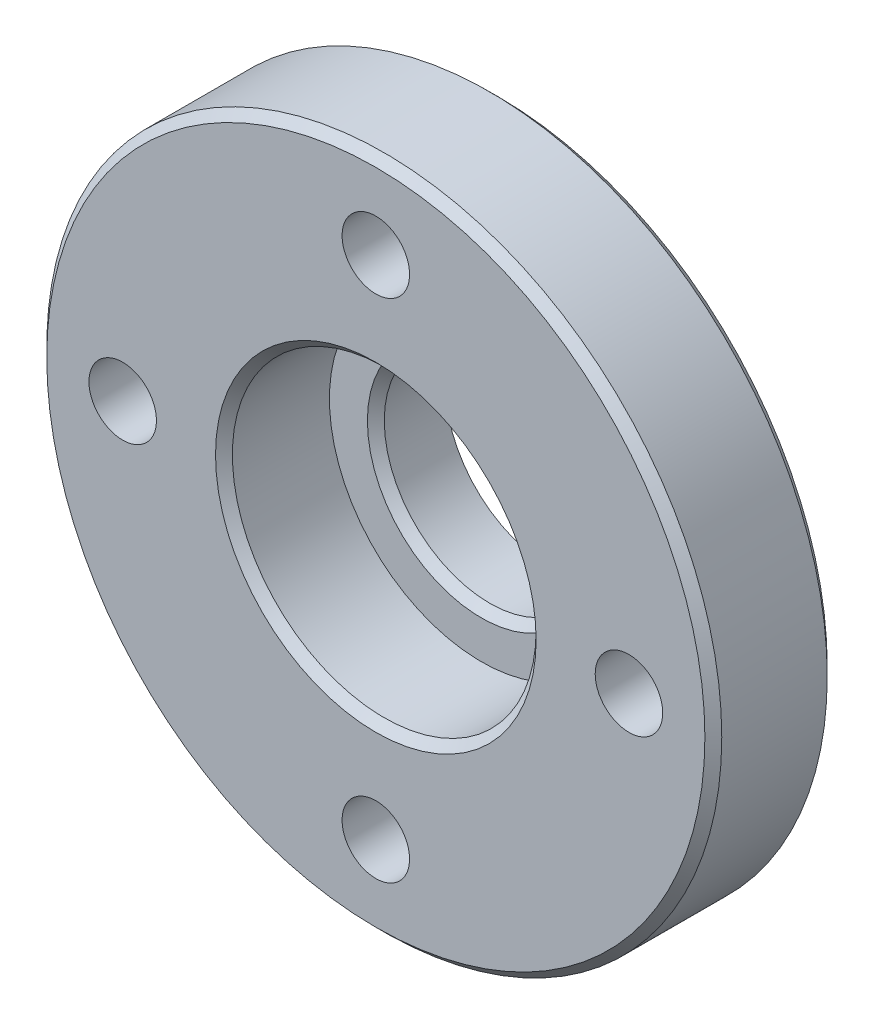
ISO-10303-21;
HEADER;
FILE_DESCRIPTION(('STEP AP214'),'2;1');
FILE_NAME('part.step','',(''),(''),'','','');
FILE_SCHEMA(('AUTOMOTIVE_DESIGN { 1 0 10303 214 1 1 1 1 }'));
ENDSEC;
DATA;
#1=APPLICATION_CONTEXT('core data for automotive mechanical design processes');
#2=APPLICATION_PROTOCOL_DEFINITION('international standard','automotive_design',2000,#1);
#3=PRODUCT_CONTEXT('',#1,'mechanical');
#4=PRODUCT('Part','Part','',(#3));
#5=PRODUCT_RELATED_PRODUCT_CATEGORY('part','',(#4));
#6=PRODUCT_DEFINITION_FORMATION('','',#4);
#7=PRODUCT_DEFINITION_CONTEXT('part definition',#1,'design');
#8=PRODUCT_DEFINITION('design','',#6,#7);
#9=PRODUCT_DEFINITION_SHAPE('','',#8);
#10=(LENGTH_UNIT() NAMED_UNIT(*) SI_UNIT(.MILLI.,.METRE.));
#11=(NAMED_UNIT(*) PLANE_ANGLE_UNIT() SI_UNIT($,.RADIAN.));
#12=(NAMED_UNIT(*) SI_UNIT($,.STERADIAN.) SOLID_ANGLE_UNIT());
#13=UNCERTAINTY_MEASURE_WITH_UNIT(LENGTH_MEASURE(1.E-05),#10,'distance_accuracy_value','');
#14=(GEOMETRIC_REPRESENTATION_CONTEXT(3) GLOBAL_UNCERTAINTY_ASSIGNED_CONTEXT((#13)) GLOBAL_UNIT_ASSIGNED_CONTEXT((#10,
#11,#12)) REPRESENTATION_CONTEXT('',''));
#15=CARTESIAN_POINT('',(0.,0.,0.));
#16=DIRECTION('',(0.,0.,1.));
#17=DIRECTION('',(1.,0.,0.));
#18=AXIS2_PLACEMENT_3D('',#15,#16,#17);
#19=CARTESIAN_POINT('',(0.,0.,0.));
#20=DIRECTION('',(0.,0.,1.));
#21=DIRECTION('',(1.,0.,0.));
#22=AXIS2_PLACEMENT_3D('',#19,#20,#21);
#23=CYLINDRICAL_SURFACE('',#22,8.);
#24=CARTESIAN_POINT('',(0.,0.,0.199999999978146));
#25=DIRECTION('',(0.,0.,-1.));
#26=DIRECTION('',(-1.,0.,0.));
#27=AXIS2_PLACEMENT_3D('',#24,#25,#26);
#28=CIRCLE('',#27,8.);
#29=CARTESIAN_POINT('',(-8.,0.,0.199999999978146));
#30=VERTEX_POINT('',#29);
#31=EDGE_CURVE('E76',#30,#30,#28,.F.);
#32=ORIENTED_EDGE('',*,*,#31,.T.);
#33=EDGE_LOOP('',(#32));
#34=FACE_BOUND('',#33,.T.);
#35=CARTESIAN_POINT('',(0.,0.,2.699999999965));
#36=DIRECTION('',(0.,0.,1.));
#37=DIRECTION('',(1.,0.,0.));
#38=AXIS2_PLACEMENT_3D('',#35,#36,#37);
#39=CIRCLE('',#38,8.);
#40=CARTESIAN_POINT('',(8.,0.,2.699999999965));
#41=VERTEX_POINT('',#40);
#42=EDGE_CURVE('E80',#41,#41,#39,.F.);
#43=ORIENTED_EDGE('',*,*,#42,.T.);
#44=EDGE_LOOP('',(#43));
#45=FACE_BOUND('',#44,.T.);
#46=ADVANCED_FACE('F40',(#34,#45),#23,.T.);
#47=CARTESIAN_POINT('',(8.,0.,0.));
#48=DIRECTION('',(0.,0.,-1.));
#49=DIRECTION('',(-1.,0.,0.));
#50=AXIS2_PLACEMENT_3D('',#47,#48,#49);
#51=PLANE('',#50);
#52=CARTESIAN_POINT('',(0.,0.,0.));
#53=DIRECTION('',(0.,0.,-1.));
#54=DIRECTION('',(-1.,0.,0.));
#55=AXIS2_PLACEMENT_3D('',#52,#53,#54);
#56=CIRCLE('',#55,3.55);
#57=CARTESIAN_POINT('',(-3.55,0.,0.));
#58=VERTEX_POINT('',#57);
#59=EDGE_CURVE('E10',#58,#58,#56,.F.);
#60=ORIENTED_EDGE('',*,*,#59,.T.);
#61=EDGE_LOOP('',(#60));
#62=FACE_BOUND('',#61,.T.);
#63=CARTESIAN_POINT('',(0.,0.,0.));
#64=DIRECTION('',(0.,0.,-1.));
#65=DIRECTION('',(-1.,0.,0.));
#66=AXIS2_PLACEMENT_3D('',#63,#64,#65);
#67=CIRCLE('',#66,7.79999999996501);
#68=CARTESIAN_POINT('',(-7.79999999996501,0.,0.));
#69=VERTEX_POINT('',#68);
#70=EDGE_CURVE('E72',#69,#69,#67,.T.);
#71=ORIENTED_EDGE('',*,*,#70,.T.);
#72=EDGE_LOOP('',(#71));
#73=FACE_BOUND('',#72,.T.);
#74=CARTESIAN_POINT('',(0.,6.,0.));
#75=DIRECTION('',(0.,0.,-1.));
#76=DIRECTION('',(-1.,0.,0.));
#77=AXIS2_PLACEMENT_3D('',#74,#75,#76);
#78=CIRCLE('',#77,0.799999999999988);
#79=CARTESIAN_POINT('',(-0.799999999999988,6.,0.));
#80=VERTEX_POINT('',#79);
#81=EDGE_CURVE('E124',#80,#80,#78,.T.);
#82=ORIENTED_EDGE('',*,*,#81,.F.);
#83=EDGE_LOOP('',(#82));
#84=FACE_BOUND('',#83,.T.);
#85=CARTESIAN_POINT('',(-6.,0.,0.));
#86=DIRECTION('',(0.,0.,-1.));
#87=DIRECTION('',(-1.,0.,0.));
#88=AXIS2_PLACEMENT_3D('',#85,#86,#87);
#89=CIRCLE('',#88,0.799999999999988);
#90=CARTESIAN_POINT('',(-6.79999999999999,0.,0.));
#91=VERTEX_POINT('',#90);
#92=EDGE_CURVE('E116',#91,#91,#89,.T.);
#93=ORIENTED_EDGE('',*,*,#92,.F.);
#94=EDGE_LOOP('',(#93));
#95=FACE_BOUND('',#94,.T.);
#96=CARTESIAN_POINT('',(0.,-6.,0.));
#97=DIRECTION('',(0.,0.,-1.));
#98=DIRECTION('',(-1.,0.,0.));
#99=AXIS2_PLACEMENT_3D('',#96,#97,#98);
#100=CIRCLE('',#99,0.799999999999988);
#101=CARTESIAN_POINT('',(-0.799999999999988,-6.,0.));
#102=VERTEX_POINT('',#101);
#103=EDGE_CURVE('E108',#102,#102,#100,.T.);
#104=ORIENTED_EDGE('',*,*,#103,.F.);
#105=EDGE_LOOP('',(#104));
#106=FACE_BOUND('',#105,.T.);
#107=CARTESIAN_POINT('',(6.,0.,0.));
#108=DIRECTION('',(0.,0.,-1.));
#109=DIRECTION('',(-1.,0.,0.));
#110=AXIS2_PLACEMENT_3D('',#107,#108,#109);
#111=CIRCLE('',#110,0.799999999999988);
#112=CARTESIAN_POINT('',(5.20000000000001,0.,0.));
#113=VERTEX_POINT('',#112);
#114=EDGE_CURVE('E100',#113,#113,#111,.T.);
#115=ORIENTED_EDGE('',*,*,#114,.F.);
#116=EDGE_LOOP('',(#115));
#117=FACE_BOUND('',#116,.T.);
#118=ADVANCED_FACE('F154',(#62,#73,#84,#95,#106,#117),#51,.T.);
#119=CARTESIAN_POINT('',(0.,0.,2.9));
#120=DIRECTION('',(0.,0.,1.));
#121=DIRECTION('',(1.,0.,0.));
#122=AXIS2_PLACEMENT_3D('',#119,#120,#121);
#123=PLANE('',#122);
#124=CARTESIAN_POINT('',(0.,0.,2.9));
#125=DIRECTION('',(0.,0.,1.));
#126=DIRECTION('',(1.,0.,0.));
#127=AXIS2_PLACEMENT_3D('',#124,#125,#126);
#128=CIRCLE('',#127,7.80000000002184);
#129=CARTESIAN_POINT('',(7.80000000002184,0.,2.9));
#130=VERTEX_POINT('',#129);
#131=EDGE_CURVE('E62',#130,#130,#128,.T.);
#132=ORIENTED_EDGE('',*,*,#131,.T.);
#133=EDGE_LOOP('',(#132));
#134=FACE_BOUND('',#133,.T.);
#135=CARTESIAN_POINT('',(0.,0.,2.9));
#136=DIRECTION('',(0.,0.,1.));
#137=DIRECTION('',(1.,0.,0.));
#138=AXIS2_PLACEMENT_3D('',#135,#136,#137);
#139=CIRCLE('',#138,3.80000000003501);
#140=CARTESIAN_POINT('',(3.80000000003501,0.,2.9));
#141=VERTEX_POINT('',#140);
#142=EDGE_CURVE('E68',#141,#141,#139,.F.);
#143=ORIENTED_EDGE('',*,*,#142,.T.);
#144=EDGE_LOOP('',(#143));
#145=FACE_BOUND('',#144,.T.);
#146=CARTESIAN_POINT('',(0.,6.,2.9));
#147=DIRECTION('',(0.,0.,-1.));
#148=DIRECTION('',(-1.,0.,0.));
#149=AXIS2_PLACEMENT_3D('',#146,#147,#148);
#150=CIRCLE('',#149,0.799999999999987);
#151=CARTESIAN_POINT('',(-0.799999999999987,6.,2.9));
#152=VERTEX_POINT('',#151);
#153=EDGE_CURVE('E120',#152,#152,#150,.T.);
#154=ORIENTED_EDGE('',*,*,#153,.T.);
#155=EDGE_LOOP('',(#154));
#156=FACE_BOUND('',#155,.T.);
#157=CARTESIAN_POINT('',(-6.,0.,2.9));
#158=DIRECTION('',(0.,0.,-1.));
#159=DIRECTION('',(-1.,0.,0.));
#160=AXIS2_PLACEMENT_3D('',#157,#158,#159);
#161=CIRCLE('',#160,0.799999999999987);
#162=CARTESIAN_POINT('',(-6.79999999999999,0.,2.9));
#163=VERTEX_POINT('',#162);
#164=EDGE_CURVE('E112',#163,#163,#161,.T.);
#165=ORIENTED_EDGE('',*,*,#164,.T.);
#166=EDGE_LOOP('',(#165));
#167=FACE_BOUND('',#166,.T.);
#168=CARTESIAN_POINT('',(0.,-6.,2.9));
#169=DIRECTION('',(0.,0.,-1.));
#170=DIRECTION('',(-1.,0.,0.));
#171=AXIS2_PLACEMENT_3D('',#168,#169,#170);
#172=CIRCLE('',#171,0.799999999999987);
#173=CARTESIAN_POINT('',(-0.799999999999987,-6.,2.9));
#174=VERTEX_POINT('',#173);
#175=EDGE_CURVE('E104',#174,#174,#172,.T.);
#176=ORIENTED_EDGE('',*,*,#175,.T.);
#177=EDGE_LOOP('',(#176));
#178=FACE_BOUND('',#177,.T.);
#179=CARTESIAN_POINT('',(6.,0.,2.9));
#180=DIRECTION('',(0.,0.,-1.));
#181=DIRECTION('',(-1.,0.,0.));
#182=AXIS2_PLACEMENT_3D('',#179,#180,#181);
#183=CIRCLE('',#182,0.799999999999987);
#184=CARTESIAN_POINT('',(5.20000000000001,0.,2.9));
#185=VERTEX_POINT('',#184);
#186=EDGE_CURVE('E96',#185,#185,#183,.T.);
#187=ORIENTED_EDGE('',*,*,#186,.T.);
#188=EDGE_LOOP('',(#187));
#189=FACE_BOUND('',#188,.T.);
#190=ADVANCED_FACE('F160',(#134,#145,#156,#167,#178,#189),#123,.T.);
#191=CARTESIAN_POINT('',(0.,0.,-1.25));
#192=DIRECTION('',(0.,0.,1.));
#193=DIRECTION('',(1.,0.,0.));
#194=AXIS2_PLACEMENT_3D('',#191,#192,#193);
#195=CYLINDRICAL_SURFACE('',#194,3.25);
#196=CARTESIAN_POINT('',(0.,0.,-0.3));
#197=DIRECTION('',(0.,0.,-1.));
#198=DIRECTION('',(-1.,0.,0.));
#199=AXIS2_PLACEMENT_3D('',#196,#197,#198);
#200=CIRCLE('',#199,3.25);
#201=CARTESIAN_POINT('',(-3.25,0.,-0.3));
#202=VERTEX_POINT('',#201);
#203=EDGE_CURVE('E48',#202,#202,#200,.T.);
#204=ORIENTED_EDGE('',*,*,#203,.T.);
#205=EDGE_LOOP('',(#204));
#206=FACE_BOUND('',#205,.T.);
#207=CARTESIAN_POINT('',(0.,0.,-1.25));
#208=DIRECTION('',(0.,0.,-1.));
#209=DIRECTION('',(-1.,0.,0.));
#210=AXIS2_PLACEMENT_3D('',#207,#208,#209);
#211=CIRCLE('',#210,3.25);
#212=CARTESIAN_POINT('',(-3.25,0.,-1.25));
#213=VERTEX_POINT('',#212);
#214=EDGE_CURVE('E92',#213,#213,#211,.T.);
#215=ORIENTED_EDGE('',*,*,#214,.F.);
#216=EDGE_LOOP('',(#215));
#217=FACE_BOUND('',#216,.T.);
#218=ADVANCED_FACE('F184',(#206,#217),#195,.T.);
#219=CARTESIAN_POINT('',(0.,0.,-1.25));
#220=DIRECTION('',(0.,0.,-1.));
#221=DIRECTION('',(-1.,0.,0.));
#222=AXIS2_PLACEMENT_3D('',#219,#220,#221);
#223=PLANE('',#222);
#224=CARTESIAN_POINT('',(0.,0.,-1.25));
#225=DIRECTION('',(0.,0.,1.));
#226=DIRECTION('',(1.,0.,0.));
#227=AXIS2_PLACEMENT_3D('',#224,#225,#226);
#228=CIRCLE('',#227,2.50000000000001);
#229=CARTESIAN_POINT('',(2.50000000000001,0.,-1.25));
#230=VERTEX_POINT('',#229);
#231=EDGE_CURVE('E128',#230,#230,#228,.T.);
#232=ORIENTED_EDGE('',*,*,#231,.T.);
#233=EDGE_LOOP('',(#232));
#234=FACE_BOUND('',#233,.T.);
#235=ORIENTED_EDGE('',*,*,#214,.T.);
#236=EDGE_LOOP('',(#235));
#237=FACE_BOUND('',#236,.T.);
#238=ADVANCED_FACE('F198',(#234,#237),#223,.T.);
#239=CARTESIAN_POINT('',(6.,0.,0.));
#240=DIRECTION('',(0.,0.,-1.));
#241=DIRECTION('',(-1.,0.,0.));
#242=AXIS2_PLACEMENT_3D('',#239,#240,#241);
#243=CYLINDRICAL_SURFACE('',#242,0.799999999999988);
#244=ORIENTED_EDGE('',*,*,#186,.F.);
#245=EDGE_LOOP('',(#244));
#246=FACE_BOUND('',#245,.T.);
#247=ORIENTED_EDGE('',*,*,#114,.T.);
#248=EDGE_LOOP('',(#247));
#249=FACE_BOUND('',#248,.T.);
#250=ADVANCED_FACE('F194',(#246,#249),#243,.F.);
#251=CARTESIAN_POINT('',(0.,-6.,0.));
#252=DIRECTION('',(0.,0.,-1.));
#253=DIRECTION('',(-1.,0.,0.));
#254=AXIS2_PLACEMENT_3D('',#251,#252,#253);
#255=CYLINDRICAL_SURFACE('',#254,0.799999999999988);
#256=ORIENTED_EDGE('',*,*,#175,.F.);
#257=EDGE_LOOP('',(#256));
#258=FACE_BOUND('',#257,.T.);
#259=ORIENTED_EDGE('',*,*,#103,.T.);
#260=EDGE_LOOP('',(#259));
#261=FACE_BOUND('',#260,.T.);
#262=ADVANCED_FACE('F197',(#258,#261),#255,.F.);
#263=CARTESIAN_POINT('',(-6.,0.,0.));
#264=DIRECTION('',(0.,0.,-1.));
#265=DIRECTION('',(-1.,0.,0.));
#266=AXIS2_PLACEMENT_3D('',#263,#264,#265);
#267=CYLINDRICAL_SURFACE('',#266,0.799999999999988);
#268=ORIENTED_EDGE('',*,*,#164,.F.);
#269=EDGE_LOOP('',(#268));
#270=FACE_BOUND('',#269,.T.);
#271=ORIENTED_EDGE('',*,*,#92,.T.);
#272=EDGE_LOOP('',(#271));
#273=FACE_BOUND('',#272,.T.);
#274=ADVANCED_FACE('F206',(#270,#273),#267,.F.);
#275=CARTESIAN_POINT('',(0.,6.,0.));
#276=DIRECTION('',(0.,0.,-1.));
#277=DIRECTION('',(-1.,0.,0.));
#278=AXIS2_PLACEMENT_3D('',#275,#276,#277);
#279=CYLINDRICAL_SURFACE('',#278,0.799999999999988);
#280=ORIENTED_EDGE('',*,*,#153,.F.);
#281=EDGE_LOOP('',(#280));
#282=FACE_BOUND('',#281,.T.);
#283=ORIENTED_EDGE('',*,*,#81,.T.);
#284=EDGE_LOOP('',(#283));
#285=FACE_BOUND('',#284,.T.);
#286=ADVANCED_FACE('F242',(#282,#285),#279,.F.);
#287=CARTESIAN_POINT('',(0.,0.,2.9));
#288=DIRECTION('',(0.,0.,1.));
#289=DIRECTION('',(1.,0.,0.));
#290=AXIS2_PLACEMENT_3D('',#287,#288,#289);
#291=CYLINDRICAL_SURFACE('',#290,2.50000000000001);
#292=CARTESIAN_POINT('',(0.,0.,0.200000000021847));
#293=DIRECTION('',(0.,0.,-1.));
#294=DIRECTION('',(-1.,0.,0.));
#295=AXIS2_PLACEMENT_3D('',#292,#293,#294);
#296=CIRCLE('',#295,2.50000000000001);
#297=CARTESIAN_POINT('',(-2.50000000000001,0.,0.200000000021847));
#298=VERTEX_POINT('',#297);
#299=EDGE_CURVE('E88',#298,#298,#296,.F.);
#300=ORIENTED_EDGE('',*,*,#299,.T.);
#301=EDGE_LOOP('',(#300));
#302=FACE_BOUND('',#301,.T.);
#303=ORIENTED_EDGE('',*,*,#231,.F.);
#304=EDGE_LOOP('',(#303));
#305=FACE_BOUND('',#304,.T.);
#306=ADVANCED_FACE('F150',(#302,#305),#291,.F.);
#307=CARTESIAN_POINT('',(2.50000000000001,0.,0.399999999999999));
#308=DIRECTION('',(0.,0.,-1.));
#309=DIRECTION('',(-1.,0.,0.));
#310=AXIS2_PLACEMENT_3D('',#307,#308,#309);
#311=PLANE('',#310);
#312=CARTESIAN_POINT('',(0.,0.,0.399999999999999));
#313=DIRECTION('',(0.,0.,-1.));
#314=DIRECTION('',(-1.,0.,0.));
#315=AXIS2_PLACEMENT_3D('',#312,#313,#314);
#316=CIRCLE('',#315,2.70000000003501);
#317=CARTESIAN_POINT('',(-2.70000000003501,0.,0.399999999999999));
#318=VERTEX_POINT('',#317);
#319=EDGE_CURVE('E84',#318,#318,#316,.T.);
#320=ORIENTED_EDGE('',*,*,#319,.T.);
#321=EDGE_LOOP('',(#320));
#322=FACE_BOUND('',#321,.T.);
#323=CARTESIAN_POINT('',(0.,0.,0.400000000000001));
#324=DIRECTION('',(0.,0.,1.));
#325=DIRECTION('',(1.,0.,0.));
#326=AXIS2_PLACEMENT_3D('',#323,#324,#325);
#327=CIRCLE('',#326,3.60000000000001);
#328=CARTESIAN_POINT('',(3.60000000000001,0.,0.400000000000001));
#329=VERTEX_POINT('',#328);
#330=EDGE_CURVE('E131',#329,#329,#327,.T.);
#331=ORIENTED_EDGE('',*,*,#330,.T.);
#332=EDGE_LOOP('',(#331));
#333=FACE_BOUND('',#332,.T.);
#334=ADVANCED_FACE('F136',(#322,#333),#311,.F.);
#335=CARTESIAN_POINT('',(0.,0.,2.9));
#336=DIRECTION('',(0.,0.,1.));
#337=DIRECTION('',(1.,0.,0.));
#338=AXIS2_PLACEMENT_3D('',#335,#336,#337);
#339=CYLINDRICAL_SURFACE('',#338,3.60000000000001);
#340=CARTESIAN_POINT('',(0.,0.,2.70000000002185));
#341=DIRECTION('',(0.,0.,1.));
#342=DIRECTION('',(1.,0.,0.));
#343=AXIS2_PLACEMENT_3D('',#340,#341,#342);
#344=CIRCLE('',#343,3.60000000000001);
#345=CARTESIAN_POINT('',(3.60000000000001,0.,2.70000000002185));
#346=VERTEX_POINT('',#345);
#347=EDGE_CURVE('E55',#346,#346,#344,.T.);
#348=ORIENTED_EDGE('',*,*,#347,.T.);
#349=EDGE_LOOP('',(#348));
#350=FACE_BOUND('',#349,.T.);
#351=ORIENTED_EDGE('',*,*,#330,.F.);
#352=EDGE_LOOP('',(#351));
#353=FACE_BOUND('',#352,.T.);
#354=ADVANCED_FACE('F138',(#350,#353),#339,.F.);
#355=CARTESIAN_POINT('',(0.,0.,0.200000000021847));
#356=DIRECTION('',(0.,0.,1.));
#357=DIRECTION('',(1.,0.,0.));
#358=AXIS2_PLACEMENT_3D('',#355,#356,#357);
#359=CONICAL_SURFACE('',#358,2.50000000000001,0.785398163539556);
#360=ORIENTED_EDGE('',*,*,#319,.F.);
#361=EDGE_LOOP('',(#360));
#362=FACE_BOUND('',#361,.T.);
#363=ORIENTED_EDGE('',*,*,#299,.F.);
#364=EDGE_LOOP('',(#363));
#365=FACE_BOUND('',#364,.T.);
#366=ADVANCED_FACE('F140',(#362,#365),#359,.F.);
#367=CARTESIAN_POINT('',(0.,0.,0.199999999978146));
#368=DIRECTION('',(0.,0.,1.));
#369=DIRECTION('',(1.,0.,0.));
#370=AXIS2_PLACEMENT_3D('',#367,#368,#369);
#371=CONICAL_SURFACE('',#370,8.,0.785398163539557);
#372=ORIENTED_EDGE('',*,*,#70,.F.);
#373=EDGE_LOOP('',(#372));
#374=FACE_BOUND('',#373,.T.);
#375=ORIENTED_EDGE('',*,*,#31,.F.);
#376=EDGE_LOOP('',(#375));
#377=FACE_BOUND('',#376,.T.);
#378=ADVANCED_FACE('F147',(#374,#377),#371,.T.);
#379=CARTESIAN_POINT('',(0.,0.,2.9));
#380=DIRECTION('',(0.,0.,-1.));
#381=DIRECTION('',(-1.,0.,0.));
#382=AXIS2_PLACEMENT_3D('',#379,#380,#381);
#383=CONICAL_SURFACE('',#382,7.80000000002184,0.78539816325534);
#384=ORIENTED_EDGE('',*,*,#42,.F.);
#385=EDGE_LOOP('',(#384));
#386=FACE_BOUND('',#385,.T.);
#387=ORIENTED_EDGE('',*,*,#131,.F.);
#388=EDGE_LOOP('',(#387));
#389=FACE_BOUND('',#388,.T.);
#390=ADVANCED_FACE('F167',(#386,#389),#383,.T.);
#391=CARTESIAN_POINT('',(0.,0.,2.70000000002185));
#392=DIRECTION('',(0.,0.,1.));
#393=DIRECTION('',(1.,0.,0.));
#394=AXIS2_PLACEMENT_3D('',#391,#392,#393);
#395=CONICAL_SURFACE('',#394,3.60000000000001,0.785398163539566);
#396=ORIENTED_EDGE('',*,*,#142,.F.);
#397=EDGE_LOOP('',(#396));
#398=FACE_BOUND('',#397,.T.);
#399=ORIENTED_EDGE('',*,*,#347,.F.);
#400=EDGE_LOOP('',(#399));
#401=FACE_BOUND('',#400,.T.);
#402=ADVANCED_FACE('F170',(#398,#401),#395,.F.);
#403=CARTESIAN_POINT('',(0.,0.,-0.3));
#404=DIRECTION('',(0.,0.,-1.));
#405=DIRECTION('',(-1.,0.,0.));
#406=AXIS2_PLACEMENT_3D('',#403,#404,#405);
#407=TOROIDAL_SURFACE('',#406,3.55,0.3);
#408=ORIENTED_EDGE('',*,*,#59,.F.);
#409=EDGE_LOOP('',(#408));
#410=FACE_BOUND('',#409,.T.);
#411=ORIENTED_EDGE('',*,*,#203,.F.);
#412=EDGE_LOOP('',(#411));
#413=FACE_BOUND('',#412,.T.);
#414=ADVANCED_FACE('F42',(#410,#413),#407,.F.);
#415=CLOSED_SHELL('',(#46,#118,#190,#218,#238,#250,#262,#274,#286,#306,#334,#354,#366,#378,#390,
#402,#414));
#416=MANIFOLD_SOLID_BREP('B2',#415);
#417=ADVANCED_BREP_SHAPE_REPRESENTATION('',(#18,#416),#14);
#418=SHAPE_DEFINITION_REPRESENTATION(#9,#417);
ENDSEC;
END-ISO-10303-21;
